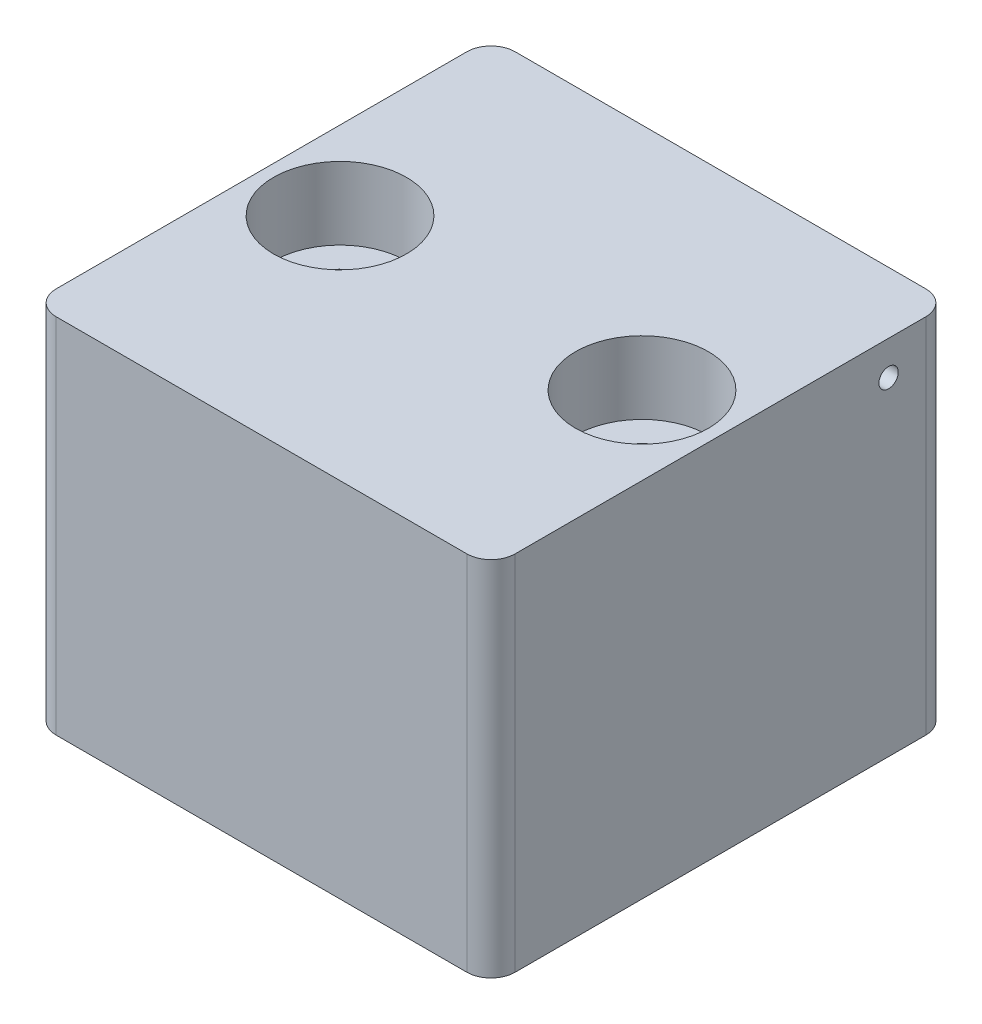
ISO-10303-21;
HEADER;
FILE_DESCRIPTION(('STEP AP214'),'2;1');
FILE_NAME('part.step','',(''),(''),'','','');
FILE_SCHEMA(('AUTOMOTIVE_DESIGN { 1 0 10303 214 1 1 1 1 }'));
ENDSEC;
DATA;
#1=APPLICATION_CONTEXT('core data for automotive mechanical design processes');
#2=APPLICATION_PROTOCOL_DEFINITION('international standard','automotive_design',2000,#1);
#3=PRODUCT_CONTEXT('',#1,'mechanical');
#4=PRODUCT('Part','Part','',(#3));
#5=PRODUCT_RELATED_PRODUCT_CATEGORY('part','',(#4));
#6=PRODUCT_DEFINITION_FORMATION('','',#4);
#7=PRODUCT_DEFINITION_CONTEXT('part definition',#1,'design');
#8=PRODUCT_DEFINITION('design','',#6,#7);
#9=PRODUCT_DEFINITION_SHAPE('','',#8);
#10=(LENGTH_UNIT() NAMED_UNIT(*) SI_UNIT(.MILLI.,.METRE.));
#11=(NAMED_UNIT(*) PLANE_ANGLE_UNIT() SI_UNIT($,.RADIAN.));
#12=(NAMED_UNIT(*) SI_UNIT($,.STERADIAN.) SOLID_ANGLE_UNIT());
#13=UNCERTAINTY_MEASURE_WITH_UNIT(LENGTH_MEASURE(1.E-05),#10,'distance_accuracy_value','');
#14=(GEOMETRIC_REPRESENTATION_CONTEXT(3) GLOBAL_UNCERTAINTY_ASSIGNED_CONTEXT((#13)) GLOBAL_UNIT_ASSIGNED_CONTEXT((#10,
#11,#12)) REPRESENTATION_CONTEXT('',''));
#15=CARTESIAN_POINT('',(0.,0.,0.));
#16=DIRECTION('',(0.,0.,1.));
#17=DIRECTION('',(1.,0.,0.));
#18=AXIS2_PLACEMENT_3D('',#15,#16,#17);
#19=CARTESIAN_POINT('',(15.75,-0.000999999999999265,-9.5));
#20=DIRECTION('',(0.,1.,0.));
#21=DIRECTION('',(0.,0.,1.));
#22=AXIS2_PLACEMENT_3D('',#19,#20,#21);
#23=CYLINDRICAL_SURFACE('',#22,1.525);
#24=CARTESIAN_POINT('',(15.75,0.,-9.5));
#25=DIRECTION('',(0.,-1.,0.));
#26=DIRECTION('',(0.,0.,-1.));
#27=AXIS2_PLACEMENT_3D('',#24,#25,#26);
#28=CIRCLE('',#27,1.525);
#29=CARTESIAN_POINT('',(15.75,0.,-7.975));
#30=VERTEX_POINT('',#29);
#31=EDGE_CURVE('E191',#30,#30,#28,.F.);
#32=CARTESIAN_POINT('',(15.75,12.,-9.5));
#33=DIRECTION('',(0.,1.,0.));
#34=DIRECTION('',(0.,0.,1.));
#35=AXIS2_PLACEMENT_3D('',#32,#33,#34);
#36=CIRCLE('',#35,1.525);
#37=CARTESIAN_POINT('',(15.75,12.,-7.975));
#38=VERTEX_POINT('',#37);
#39=EDGE_CURVE('E42',#38,#38,#36,.F.);
#40=CARTESIAN_POINT('',(15.75,0.,-7.975));
#41=CARTESIAN_POINT('',(15.75,0.125,-7.975));
#42=CARTESIAN_POINT('',(15.75,0.25,-7.975));
#43=CARTESIAN_POINT('',(15.75,0.5,-7.975));
#44=CARTESIAN_POINT('',(15.75,0.625,-7.975));
#45=CARTESIAN_POINT('',(15.75,0.875,-7.975));
#46=CARTESIAN_POINT('',(15.75,1.,-7.975));
#47=CARTESIAN_POINT('',(15.75,1.25,-7.975));
#48=CARTESIAN_POINT('',(15.75,1.375,-7.975));
#49=CARTESIAN_POINT('',(15.75,1.625,-7.975));
#50=CARTESIAN_POINT('',(15.75,1.75,-7.975));
#51=CARTESIAN_POINT('',(15.75,2.,-7.975));
#52=CARTESIAN_POINT('',(15.75,2.125,-7.975));
#53=CARTESIAN_POINT('',(15.75,2.375,-7.975));
#54=CARTESIAN_POINT('',(15.75,2.5,-7.975));
#55=CARTESIAN_POINT('',(15.75,2.75,-7.975));
#56=CARTESIAN_POINT('',(15.75,2.875,-7.975));
#57=CARTESIAN_POINT('',(15.75,3.125,-7.975));
#58=CARTESIAN_POINT('',(15.75,3.25,-7.975));
#59=CARTESIAN_POINT('',(15.75,3.5,-7.975));
#60=CARTESIAN_POINT('',(15.75,3.625,-7.975));
#61=CARTESIAN_POINT('',(15.75,3.875,-7.975));
#62=CARTESIAN_POINT('',(15.75,4.,-7.975));
#63=CARTESIAN_POINT('',(15.75,4.25,-7.975));
#64=CARTESIAN_POINT('',(15.75,4.375,-7.975));
#65=CARTESIAN_POINT('',(15.75,4.625,-7.975));
#66=CARTESIAN_POINT('',(15.75,4.75,-7.975));
#67=CARTESIAN_POINT('',(15.75,5.,-7.975));
#68=CARTESIAN_POINT('',(15.75,5.125,-7.975));
#69=CARTESIAN_POINT('',(15.75,5.375,-7.975));
#70=CARTESIAN_POINT('',(15.75,5.5,-7.975));
#71=CARTESIAN_POINT('',(15.75,5.75,-7.975));
#72=CARTESIAN_POINT('',(15.75,5.875,-7.975));
#73=CARTESIAN_POINT('',(15.75,6.125,-7.975));
#74=CARTESIAN_POINT('',(15.75,6.25,-7.975));
#75=CARTESIAN_POINT('',(15.75,6.5,-7.975));
#76=CARTESIAN_POINT('',(15.75,6.625,-7.975));
#77=CARTESIAN_POINT('',(15.75,6.875,-7.975));
#78=CARTESIAN_POINT('',(15.75,7.,-7.975));
#79=CARTESIAN_POINT('',(15.75,7.25,-7.975));
#80=CARTESIAN_POINT('',(15.75,7.375,-7.975));
#81=CARTESIAN_POINT('',(15.75,7.625,-7.975));
#82=CARTESIAN_POINT('',(15.75,7.75,-7.975));
#83=CARTESIAN_POINT('',(15.75,8.,-7.975));
#84=CARTESIAN_POINT('',(15.75,8.125,-7.975));
#85=CARTESIAN_POINT('',(15.75,8.375,-7.975));
#86=CARTESIAN_POINT('',(15.75,8.5,-7.975));
#87=CARTESIAN_POINT('',(15.75,8.75,-7.975));
#88=CARTESIAN_POINT('',(15.75,8.875,-7.975));
#89=CARTESIAN_POINT('',(15.75,9.125,-7.975));
#90=CARTESIAN_POINT('',(15.75,9.25,-7.975));
#91=CARTESIAN_POINT('',(15.75,9.5,-7.975));
#92=CARTESIAN_POINT('',(15.75,9.625,-7.975));
#93=CARTESIAN_POINT('',(15.75,9.875,-7.975));
#94=CARTESIAN_POINT('',(15.75,10.,-7.975));
#95=CARTESIAN_POINT('',(15.75,10.25,-7.975));
#96=CARTESIAN_POINT('',(15.75,10.375,-7.975));
#97=CARTESIAN_POINT('',(15.75,10.625,-7.975));
#98=CARTESIAN_POINT('',(15.75,10.75,-7.975));
#99=CARTESIAN_POINT('',(15.75,11.,-7.975));
#100=CARTESIAN_POINT('',(15.75,11.125,-7.975));
#101=CARTESIAN_POINT('',(15.75,11.375,-7.975));
#102=CARTESIAN_POINT('',(15.75,11.5,-7.975));
#103=CARTESIAN_POINT('',(15.75,11.75,-7.975));
#104=CARTESIAN_POINT('',(15.75,11.875,-7.975));
#105=CARTESIAN_POINT('',(15.75,12.,-7.975));
#106=B_SPLINE_CURVE_WITH_KNOTS('',3,(#40,#41,#42,#43,#44,#45,#46,#47,#48,#49,#50,#51,#52,#53,
#54,#55,#56,#57,#58,#59,#60,#61,#62,#63,#64,#65,#66,#67,#68,#69,#70,#71,#72,#73,#74,#75,#76,#77,
#78,#79,#80,#81,#82,#83,#84,#85,#86,#87,#88,#89,#90,#91,#92,#93,#94,#95,#96,#97,#98,#99,#100,
#101,#102,#103,#104,#105),.UNSPECIFIED.,.F.,.F.,(4,2,2,2,2,2,2,2,2,2,2,2,2,2,2,2,2,2,2,2,2,2,2,
2,2,2,2,2,2,2,2,2,4),(0.,0.375,0.75,1.125,1.5,1.875,2.25,2.625,3.,3.375,3.75,4.125,4.5,4.875,
5.25,5.625,6.,6.375,6.75,7.125,7.5,7.875,8.25,8.625,9.,9.375,9.75,10.125,10.5,10.875,11.25,
11.625,12.),.UNSPECIFIED.);
#107=EDGE_CURVE('BSEAM38',#30,#38,#106,.T.);
#108=ORIENTED_EDGE('',*,*,#31,.F.);
#109=ORIENTED_EDGE('',*,*,#39,.F.);
#110=ORIENTED_EDGE('',*,*,#107,.T.);
#111=ORIENTED_EDGE('',*,*,#107,.F.);
#112=EDGE_LOOP('',(#108,#110,#109,#111));
#113=FACE_BOUND('',#112,.T.);
#114=ADVANCED_FACE('F38',(#113),#23,.F.);
#115=CARTESIAN_POINT('',(3.25,-0.000999999999999265,-9.5));
#116=DIRECTION('',(0.,1.,0.));
#117=DIRECTION('',(0.,0.,1.));
#118=AXIS2_PLACEMENT_3D('',#115,#116,#117);
#119=CYLINDRICAL_SURFACE('',#118,1.525);
#120=CARTESIAN_POINT('',(3.25,0.,-9.5));
#121=DIRECTION('',(0.,-1.,0.));
#122=DIRECTION('',(0.,0.,-1.));
#123=AXIS2_PLACEMENT_3D('',#120,#121,#122);
#124=CIRCLE('',#123,1.525);
#125=CARTESIAN_POINT('',(3.25,0.,-7.975));
#126=VERTEX_POINT('',#125);
#127=EDGE_CURVE('E147',#126,#126,#124,.F.);
#128=CARTESIAN_POINT('',(3.25,12.,-9.5));
#129=DIRECTION('',(0.,1.,0.));
#130=DIRECTION('',(0.,0.,1.));
#131=AXIS2_PLACEMENT_3D('',#128,#129,#130);
#132=CIRCLE('',#131,1.525);
#133=CARTESIAN_POINT('',(3.25,12.,-7.975));
#134=VERTEX_POINT('',#133);
#135=EDGE_CURVE('E182',#134,#134,#132,.F.);
#136=CARTESIAN_POINT('',(3.25,0.,-7.975));
#137=CARTESIAN_POINT('',(3.25,0.125,-7.975));
#138=CARTESIAN_POINT('',(3.25,0.25,-7.975));
#139=CARTESIAN_POINT('',(3.25,0.5,-7.975));
#140=CARTESIAN_POINT('',(3.25,0.625,-7.975));
#141=CARTESIAN_POINT('',(3.25,0.875,-7.975));
#142=CARTESIAN_POINT('',(3.25,1.,-7.975));
#143=CARTESIAN_POINT('',(3.25,1.25,-7.975));
#144=CARTESIAN_POINT('',(3.25,1.375,-7.975));
#145=CARTESIAN_POINT('',(3.25,1.625,-7.975));
#146=CARTESIAN_POINT('',(3.25,1.75,-7.975));
#147=CARTESIAN_POINT('',(3.25,2.,-7.975));
#148=CARTESIAN_POINT('',(3.25,2.125,-7.975));
#149=CARTESIAN_POINT('',(3.25,2.375,-7.975));
#150=CARTESIAN_POINT('',(3.25,2.5,-7.975));
#151=CARTESIAN_POINT('',(3.25,2.75,-7.975));
#152=CARTESIAN_POINT('',(3.25,2.875,-7.975));
#153=CARTESIAN_POINT('',(3.25,3.125,-7.975));
#154=CARTESIAN_POINT('',(3.25,3.25,-7.975));
#155=CARTESIAN_POINT('',(3.25,3.5,-7.975));
#156=CARTESIAN_POINT('',(3.25,3.625,-7.975));
#157=CARTESIAN_POINT('',(3.25,3.875,-7.975));
#158=CARTESIAN_POINT('',(3.25,4.,-7.975));
#159=CARTESIAN_POINT('',(3.25,4.25,-7.975));
#160=CARTESIAN_POINT('',(3.25,4.375,-7.975));
#161=CARTESIAN_POINT('',(3.25,4.625,-7.975));
#162=CARTESIAN_POINT('',(3.25,4.75,-7.975));
#163=CARTESIAN_POINT('',(3.25,5.,-7.975));
#164=CARTESIAN_POINT('',(3.25,5.125,-7.975));
#165=CARTESIAN_POINT('',(3.25,5.375,-7.975));
#166=CARTESIAN_POINT('',(3.25,5.5,-7.975));
#167=CARTESIAN_POINT('',(3.25,5.75,-7.975));
#168=CARTESIAN_POINT('',(3.25,5.875,-7.975));
#169=CARTESIAN_POINT('',(3.25,6.125,-7.975));
#170=CARTESIAN_POINT('',(3.25,6.25,-7.975));
#171=CARTESIAN_POINT('',(3.25,6.5,-7.975));
#172=CARTESIAN_POINT('',(3.25,6.625,-7.975));
#173=CARTESIAN_POINT('',(3.25,6.875,-7.975));
#174=CARTESIAN_POINT('',(3.25,7.,-7.975));
#175=CARTESIAN_POINT('',(3.25,7.25,-7.975));
#176=CARTESIAN_POINT('',(3.25,7.375,-7.975));
#177=CARTESIAN_POINT('',(3.25,7.625,-7.975));
#178=CARTESIAN_POINT('',(3.25,7.75,-7.975));
#179=CARTESIAN_POINT('',(3.25,8.,-7.975));
#180=CARTESIAN_POINT('',(3.25,8.125,-7.975));
#181=CARTESIAN_POINT('',(3.25,8.375,-7.975));
#182=CARTESIAN_POINT('',(3.25,8.5,-7.975));
#183=CARTESIAN_POINT('',(3.25,8.75,-7.975));
#184=CARTESIAN_POINT('',(3.25,8.875,-7.975));
#185=CARTESIAN_POINT('',(3.25,9.125,-7.975));
#186=CARTESIAN_POINT('',(3.25,9.25,-7.975));
#187=CARTESIAN_POINT('',(3.25,9.5,-7.975));
#188=CARTESIAN_POINT('',(3.25,9.625,-7.975));
#189=CARTESIAN_POINT('',(3.25,9.875,-7.975));
#190=CARTESIAN_POINT('',(3.25,10.,-7.975));
#191=CARTESIAN_POINT('',(3.25,10.25,-7.975));
#192=CARTESIAN_POINT('',(3.25,10.375,-7.975));
#193=CARTESIAN_POINT('',(3.25,10.625,-7.975));
#194=CARTESIAN_POINT('',(3.25,10.75,-7.975));
#195=CARTESIAN_POINT('',(3.25,11.,-7.975));
#196=CARTESIAN_POINT('',(3.25,11.125,-7.975));
#197=CARTESIAN_POINT('',(3.25,11.375,-7.975));
#198=CARTESIAN_POINT('',(3.25,11.5,-7.975));
#199=CARTESIAN_POINT('',(3.25,11.75,-7.975));
#200=CARTESIAN_POINT('',(3.25,11.875,-7.975));
#201=CARTESIAN_POINT('',(3.25,12.,-7.975));
#202=B_SPLINE_CURVE_WITH_KNOTS('',3,(#136,#137,#138,#139,#140,#141,#142,#143,#144,#145,#146,
#147,#148,#149,#150,#151,#152,#153,#154,#155,#156,#157,#158,#159,#160,#161,#162,#163,#164,#165,
#166,#167,#168,#169,#170,#171,#172,#173,#174,#175,#176,#177,#178,#179,#180,#181,#182,#183,#184,
#185,#186,#187,#188,#189,#190,#191,#192,#193,#194,#195,#196,#197,#198,#199,#200,#201),
.UNSPECIFIED.,.F.,.F.,(4,2,2,2,2,2,2,2,2,2,2,2,2,2,2,2,2,2,2,2,2,2,2,2,2,2,2,2,2,2,2,2,4),(0.,
0.375,0.75,1.125,1.5,1.875,2.25,2.625,3.,3.375,3.75,4.125,4.5,4.875,5.25,5.625,6.,6.375,6.75,
7.125,7.5,7.875,8.25,8.625,9.,9.375,9.75,10.125,10.5,10.875,11.25,11.625,12.),.UNSPECIFIED.);
#203=EDGE_CURVE('BSEAM261',#126,#134,#202,.T.);
#204=ORIENTED_EDGE('',*,*,#127,.F.);
#205=ORIENTED_EDGE('',*,*,#135,.F.);
#206=ORIENTED_EDGE('',*,*,#203,.T.);
#207=ORIENTED_EDGE('',*,*,#203,.F.);
#208=EDGE_LOOP('',(#204,#206,#205,#207));
#209=FACE_BOUND('',#208,.T.);
#210=ADVANCED_FACE('F261',(#209),#119,.F.);
#211=CARTESIAN_POINT('',(18.,15.,-18.));
#212=DIRECTION('',(0.,-1.,0.));
#213=DIRECTION('',(0.,0.,-1.));
#214=AXIS2_PLACEMENT_3D('',#211,#212,#213);
#215=CYLINDRICAL_SURFACE('',#214,1.);
#216=CARTESIAN_POINT('',(18.,0.,-18.));
#217=DIRECTION('',(0.,1.,0.));
#218=DIRECTION('',(0.,0.,-1.));
#219=AXIS2_PLACEMENT_3D('',#216,#217,#218);
#220=CIRCLE('',#219,1.);
#221=CARTESIAN_POINT('',(19.,0.,-18.));
#222=VERTEX_POINT('',#221);
#223=CARTESIAN_POINT('',(18.,0.,-19.));
#224=VERTEX_POINT('',#223);
#225=EDGE_CURVE('E142',#222,#224,#220,.T.);
#226=ORIENTED_EDGE('',*,*,#225,.T.);
#227=DIRECTION('',(0.,-1.,0.));
#228=VECTOR('',#227,1.);
#229=CARTESIAN_POINT('',(18.,15.,-19.));
#230=LINE('',#229,#228);
#231=CARTESIAN_POINT('',(18.,15.,-19.));
#232=VERTEX_POINT('',#231);
#233=EDGE_CURVE('E11',#232,#224,#230,.T.);
#234=ORIENTED_EDGE('',*,*,#233,.F.);
#235=CARTESIAN_POINT('',(18.,15.,-18.));
#236=DIRECTION('',(0.,1.,0.));
#237=DIRECTION('',(0.,0.,-1.));
#238=AXIS2_PLACEMENT_3D('',#235,#236,#237);
#239=CIRCLE('',#238,1.);
#240=CARTESIAN_POINT('',(19.,15.,-18.));
#241=VERTEX_POINT('',#240);
#242=EDGE_CURVE('E165',#241,#232,#239,.T.);
#243=ORIENTED_EDGE('',*,*,#242,.F.);
#244=DIRECTION('',(0.,-1.,0.));
#245=VECTOR('',#244,1.);
#246=CARTESIAN_POINT('',(19.,15.,-18.));
#247=LINE('',#246,#245);
#248=EDGE_CURVE('E138',#241,#222,#247,.T.);
#249=ORIENTED_EDGE('',*,*,#248,.T.);
#250=EDGE_LOOP('',(#226,#234,#243,#249));
#251=FACE_BOUND('',#250,.T.);
#252=ADVANCED_FACE('F40',(#251),#215,.T.);
#253=CARTESIAN_POINT('',(1.00000000000001,15.,-19.));
#254=DIRECTION('',(0.,0.,1.));
#255=DIRECTION('',(1.,0.,0.));
#256=AXIS2_PLACEMENT_3D('',#253,#254,#255);
#257=PLANE('',#256);
#258=DIRECTION('',(-1.,0.,0.));
#259=VECTOR('',#258,1.);
#260=CARTESIAN_POINT('',(1.00000000000001,0.,-19.));
#261=LINE('',#260,#259);
#262=CARTESIAN_POINT('',(1.00000000000001,0.,-19.));
#263=VERTEX_POINT('',#262);
#264=EDGE_CURVE('E146',#224,#263,#261,.T.);
#265=ORIENTED_EDGE('',*,*,#264,.T.);
#266=DIRECTION('',(0.,-1.,0.));
#267=VECTOR('',#266,1.);
#268=CARTESIAN_POINT('',(1.00000000000001,15.,-19.));
#269=LINE('',#268,#267);
#270=CARTESIAN_POINT('',(1.00000000000001,15.,-19.));
#271=VERTEX_POINT('',#270);
#272=EDGE_CURVE('E49',#271,#263,#269,.T.);
#273=ORIENTED_EDGE('',*,*,#272,.F.);
#274=DIRECTION('',(-1.,0.,0.));
#275=VECTOR('',#274,1.);
#276=CARTESIAN_POINT('',(1.00000000000001,15.,-19.));
#277=LINE('',#276,#275);
#278=EDGE_CURVE('E101',#232,#271,#277,.T.);
#279=ORIENTED_EDGE('',*,*,#278,.F.);
#280=ORIENTED_EDGE('',*,*,#233,.T.);
#281=EDGE_LOOP('',(#265,#273,#279,#280));
#282=FACE_BOUND('',#281,.T.);
#283=ADVANCED_FACE('F323',(#282),#257,.F.);
#284=CARTESIAN_POINT('',(1.,15.,-18.));
#285=DIRECTION('',(0.,-1.,0.));
#286=DIRECTION('',(0.,0.,-1.));
#287=AXIS2_PLACEMENT_3D('',#284,#285,#286);
#288=CYLINDRICAL_SURFACE('',#287,1.);
#289=CARTESIAN_POINT('',(1.,0.,-18.));
#290=DIRECTION('',(0.,1.,0.));
#291=DIRECTION('',(0.,0.,-1.));
#292=AXIS2_PLACEMENT_3D('',#289,#290,#291);
#293=CIRCLE('',#292,1.);
#294=CARTESIAN_POINT('',(0.,0.,-18.));
#295=VERTEX_POINT('',#294);
#296=EDGE_CURVE('E150',#263,#295,#293,.T.);
#297=ORIENTED_EDGE('',*,*,#296,.T.);
#298=DIRECTION('',(0.,-1.,0.));
#299=VECTOR('',#298,1.);
#300=CARTESIAN_POINT('',(0.,15.,-18.));
#301=LINE('',#300,#299);
#302=CARTESIAN_POINT('',(0.,15.,-18.));
#303=VERTEX_POINT('',#302);
#304=EDGE_CURVE('E176',#303,#295,#301,.T.);
#305=ORIENTED_EDGE('',*,*,#304,.F.);
#306=CARTESIAN_POINT('',(1.,15.,-18.));
#307=DIRECTION('',(0.,1.,0.));
#308=DIRECTION('',(0.,0.,-1.));
#309=AXIS2_PLACEMENT_3D('',#306,#307,#308);
#310=CIRCLE('',#309,1.);
#311=EDGE_CURVE('E222',#271,#303,#310,.T.);
#312=ORIENTED_EDGE('',*,*,#311,.F.);
#313=ORIENTED_EDGE('',*,*,#272,.T.);
#314=EDGE_LOOP('',(#297,#305,#312,#313));
#315=FACE_BOUND('',#314,.T.);
#316=ADVANCED_FACE('F316',(#315),#288,.T.);
#317=CARTESIAN_POINT('',(0.,15.,-1.00000000000001));
#318=DIRECTION('',(1.,0.,0.));
#319=DIRECTION('',(0.,0.,-1.));
#320=AXIS2_PLACEMENT_3D('',#317,#318,#319);
#321=PLANE('',#320);
#322=CARTESIAN_POINT('',(0.,13.5876838207487,-16.458209363325));
#323=DIRECTION('',(-1.,0.,0.));
#324=DIRECTION('',(0.,0.,1.));
#325=AXIS2_PLACEMENT_3D('',#322,#323,#324);
#326=CIRCLE('',#325,0.400000000000002);
#327=CARTESIAN_POINT('',(0.,13.5876838207487,-16.058209363325));
#328=VERTEX_POINT('',#327);
#329=EDGE_CURVE('E311',#328,#328,#326,.T.);
#330=ORIENTED_EDGE('',*,*,#329,.F.);
#331=EDGE_LOOP('',(#330));
#332=FACE_BOUND('',#331,.T.);
#333=DIRECTION('',(0.,0.,1.));
#334=VECTOR('',#333,1.);
#335=CARTESIAN_POINT('',(0.,0.,-1.00000000000001));
#336=LINE('',#335,#334);
#337=CARTESIAN_POINT('',(0.,0.,-1.00000000000001));
#338=VERTEX_POINT('',#337);
#339=EDGE_CURVE('E153',#295,#338,#336,.T.);
#340=ORIENTED_EDGE('',*,*,#339,.T.);
#341=DIRECTION('',(0.,-1.,0.));
#342=VECTOR('',#341,1.);
#343=CARTESIAN_POINT('',(0.,15.,-1.00000000000001));
#344=LINE('',#343,#342);
#345=CARTESIAN_POINT('',(0.,15.,-1.00000000000001));
#346=VERTEX_POINT('',#345);
#347=EDGE_CURVE('E172',#346,#338,#344,.T.);
#348=ORIENTED_EDGE('',*,*,#347,.F.);
#349=DIRECTION('',(0.,0.,1.));
#350=VECTOR('',#349,1.);
#351=CARTESIAN_POINT('',(0.,15.,-1.00000000000001));
#352=LINE('',#351,#350);
#353=EDGE_CURVE('E225',#303,#346,#352,.T.);
#354=ORIENTED_EDGE('',*,*,#353,.F.);
#355=ORIENTED_EDGE('',*,*,#304,.T.);
#356=EDGE_LOOP('',(#340,#348,#354,#355));
#357=FACE_BOUND('',#356,.T.);
#358=ADVANCED_FACE('F233',(#332,#357),#321,.F.);
#359=CARTESIAN_POINT('',(1.,15.,-1.));
#360=DIRECTION('',(0.,-1.,0.));
#361=DIRECTION('',(0.,0.,-1.));
#362=AXIS2_PLACEMENT_3D('',#359,#360,#361);
#363=CYLINDRICAL_SURFACE('',#362,1.);
#364=CARTESIAN_POINT('',(1.,0.,-1.));
#365=DIRECTION('',(0.,1.,0.));
#366=DIRECTION('',(0.,0.,-1.));
#367=AXIS2_PLACEMENT_3D('',#364,#365,#366);
#368=CIRCLE('',#367,1.);
#369=CARTESIAN_POINT('',(1.00000000000001,0.,0.));
#370=VERTEX_POINT('',#369);
#371=EDGE_CURVE('E156',#338,#370,#368,.T.);
#372=ORIENTED_EDGE('',*,*,#371,.T.);
#373=DIRECTION('',(0.,-1.,0.));
#374=VECTOR('',#373,1.);
#375=CARTESIAN_POINT('',(1.00000000000001,15.,0.));
#376=LINE('',#375,#374);
#377=CARTESIAN_POINT('',(1.00000000000001,15.,0.));
#378=VERTEX_POINT('',#377);
#379=EDGE_CURVE('E131',#378,#370,#376,.T.);
#380=ORIENTED_EDGE('',*,*,#379,.F.);
#381=CARTESIAN_POINT('',(1.,15.,-1.));
#382=DIRECTION('',(0.,1.,0.));
#383=DIRECTION('',(0.,0.,-1.));
#384=AXIS2_PLACEMENT_3D('',#381,#382,#383);
#385=CIRCLE('',#384,1.);
#386=EDGE_CURVE('E120',#346,#378,#385,.T.);
#387=ORIENTED_EDGE('',*,*,#386,.F.);
#388=ORIENTED_EDGE('',*,*,#347,.T.);
#389=EDGE_LOOP('',(#372,#380,#387,#388));
#390=FACE_BOUND('',#389,.T.);
#391=ADVANCED_FACE('F237',(#390),#363,.T.);
#392=CARTESIAN_POINT('',(1.00000000000001,15.,0.));
#393=DIRECTION('',(0.,0.,-1.));
#394=DIRECTION('',(-1.,0.,0.));
#395=AXIS2_PLACEMENT_3D('',#392,#393,#394);
#396=PLANE('',#395);
#397=DIRECTION('',(1.,0.,0.));
#398=VECTOR('',#397,1.);
#399=CARTESIAN_POINT('',(1.00000000000001,0.,0.));
#400=LINE('',#399,#398);
#401=CARTESIAN_POINT('',(18.,0.,0.));
#402=VERTEX_POINT('',#401);
#403=EDGE_CURVE('E129',#370,#402,#400,.T.);
#404=ORIENTED_EDGE('',*,*,#403,.T.);
#405=DIRECTION('',(0.,-1.,0.));
#406=VECTOR('',#405,1.);
#407=CARTESIAN_POINT('',(18.,15.,0.));
#408=LINE('',#407,#406);
#409=CARTESIAN_POINT('',(18.,15.,0.));
#410=VERTEX_POINT('',#409);
#411=EDGE_CURVE('E126',#410,#402,#408,.T.);
#412=ORIENTED_EDGE('',*,*,#411,.F.);
#413=DIRECTION('',(1.,0.,0.));
#414=VECTOR('',#413,1.);
#415=CARTESIAN_POINT('',(1.00000000000001,15.,0.));
#416=LINE('',#415,#414);
#417=EDGE_CURVE('E114',#378,#410,#416,.T.);
#418=ORIENTED_EDGE('',*,*,#417,.F.);
#419=ORIENTED_EDGE('',*,*,#379,.T.);
#420=EDGE_LOOP('',(#404,#412,#418,#419));
#421=FACE_BOUND('',#420,.T.);
#422=ADVANCED_FACE('F127',(#421),#396,.F.);
#423=CARTESIAN_POINT('',(18.,15.,-1.));
#424=DIRECTION('',(0.,-1.,0.));
#425=DIRECTION('',(0.,0.,-1.));
#426=AXIS2_PLACEMENT_3D('',#423,#424,#425);
#427=CYLINDRICAL_SURFACE('',#426,1.);
#428=CARTESIAN_POINT('',(18.,0.,-1.));
#429=DIRECTION('',(0.,1.,0.));
#430=DIRECTION('',(0.,0.,1.));
#431=AXIS2_PLACEMENT_3D('',#428,#429,#430);
#432=CIRCLE('',#431,1.);
#433=CARTESIAN_POINT('',(19.,0.,-1.));
#434=VERTEX_POINT('',#433);
#435=EDGE_CURVE('E87',#402,#434,#432,.T.);
#436=ORIENTED_EDGE('',*,*,#435,.T.);
#437=DIRECTION('',(0.,-1.,0.));
#438=VECTOR('',#437,1.);
#439=CARTESIAN_POINT('',(19.,15.,-1.));
#440=LINE('',#439,#438);
#441=CARTESIAN_POINT('',(19.,15.,-1.));
#442=VERTEX_POINT('',#441);
#443=EDGE_CURVE('E132',#442,#434,#440,.T.);
#444=ORIENTED_EDGE('',*,*,#443,.F.);
#445=CARTESIAN_POINT('',(18.,15.,-1.));
#446=DIRECTION('',(0.,1.,0.));
#447=DIRECTION('',(0.,0.,1.));
#448=AXIS2_PLACEMENT_3D('',#445,#446,#447);
#449=CIRCLE('',#448,1.);
#450=EDGE_CURVE('E118',#410,#442,#449,.T.);
#451=ORIENTED_EDGE('',*,*,#450,.F.);
#452=ORIENTED_EDGE('',*,*,#411,.T.);
#453=EDGE_LOOP('',(#436,#444,#451,#452));
#454=FACE_BOUND('',#453,.T.);
#455=ADVANCED_FACE('F134',(#454),#427,.T.);
#456=CARTESIAN_POINT('',(19.,15.,-1.));
#457=DIRECTION('',(-1.,0.,0.));
#458=DIRECTION('',(0.,0.,1.));
#459=AXIS2_PLACEMENT_3D('',#456,#457,#458);
#460=PLANE('',#459);
#461=CARTESIAN_POINT('',(19.,13.5876838207487,-16.458209363325));
#462=DIRECTION('',(-1.,0.,0.));
#463=DIRECTION('',(0.,0.,1.));
#464=AXIS2_PLACEMENT_3D('',#461,#462,#463);
#465=CIRCLE('',#464,0.400000000000002);
#466=CARTESIAN_POINT('',(19.,13.5876838207487,-16.058209363325));
#467=VERTEX_POINT('',#466);
#468=EDGE_CURVE('E202',#467,#467,#465,.F.);
#469=ORIENTED_EDGE('',*,*,#468,.F.);
#470=EDGE_LOOP('',(#469));
#471=FACE_BOUND('',#470,.T.);
#472=DIRECTION('',(0.,0.,-1.));
#473=VECTOR('',#472,1.);
#474=CARTESIAN_POINT('',(19.,0.,-1.));
#475=LINE('',#474,#473);
#476=EDGE_CURVE('E93',#434,#222,#475,.T.);
#477=ORIENTED_EDGE('',*,*,#476,.T.);
#478=ORIENTED_EDGE('',*,*,#248,.F.);
#479=DIRECTION('',(0.,0.,-1.));
#480=VECTOR('',#479,1.);
#481=CARTESIAN_POINT('',(19.,15.,-1.));
#482=LINE('',#481,#480);
#483=EDGE_CURVE('E58',#442,#241,#482,.T.);
#484=ORIENTED_EDGE('',*,*,#483,.F.);
#485=ORIENTED_EDGE('',*,*,#443,.T.);
#486=EDGE_LOOP('',(#477,#478,#484,#485));
#487=FACE_BOUND('',#486,.T.);
#488=ADVANCED_FACE('F245',(#471,#487),#460,.F.);
#489=CARTESIAN_POINT('',(18.,15.,-18.));
#490=DIRECTION('',(0.,-1.,0.));
#491=DIRECTION('',(0.,0.,-1.));
#492=AXIS2_PLACEMENT_3D('',#489,#490,#491);
#493=PLANE('',#492);
#494=CARTESIAN_POINT('',(3.25,15.,-9.5));
#495=DIRECTION('',(0.,1.,0.));
#496=DIRECTION('',(0.,0.,1.));
#497=AXIS2_PLACEMENT_3D('',#494,#495,#496);
#498=CIRCLE('',#497,2.75);
#499=CARTESIAN_POINT('',(3.25,15.,-6.75));
#500=VERTEX_POINT('',#499);
#501=EDGE_CURVE('E193',#500,#500,#498,.T.);
#502=ORIENTED_EDGE('',*,*,#501,.F.);
#503=EDGE_LOOP('',(#502));
#504=FACE_BOUND('',#503,.T.);
#505=CARTESIAN_POINT('',(15.75,15.,-9.5));
#506=DIRECTION('',(0.,1.,0.));
#507=DIRECTION('',(0.,0.,1.));
#508=AXIS2_PLACEMENT_3D('',#505,#506,#507);
#509=CIRCLE('',#508,2.75);
#510=CARTESIAN_POINT('',(15.75,15.,-6.75));
#511=VERTEX_POINT('',#510);
#512=EDGE_CURVE('E208',#511,#511,#509,.T.);
#513=ORIENTED_EDGE('',*,*,#512,.F.);
#514=EDGE_LOOP('',(#513));
#515=FACE_BOUND('',#514,.T.);
#516=ORIENTED_EDGE('',*,*,#242,.T.);
#517=ORIENTED_EDGE('',*,*,#278,.T.);
#518=ORIENTED_EDGE('',*,*,#311,.T.);
#519=ORIENTED_EDGE('',*,*,#353,.T.);
#520=ORIENTED_EDGE('',*,*,#386,.T.);
#521=ORIENTED_EDGE('',*,*,#417,.T.);
#522=ORIENTED_EDGE('',*,*,#450,.T.);
#523=ORIENTED_EDGE('',*,*,#483,.T.);
#524=EDGE_LOOP('',(#516,#517,#518,#519,#520,#521,#522,#523));
#525=FACE_BOUND('',#524,.T.);
#526=ADVANCED_FACE('F116',(#504,#515,#525),#493,.F.);
#527=CARTESIAN_POINT('',(18.,0.,-18.));
#528=DIRECTION('',(0.,-1.,0.));
#529=DIRECTION('',(0.,0.,-1.));
#530=AXIS2_PLACEMENT_3D('',#527,#528,#529);
#531=PLANE('',#530);
#532=ORIENTED_EDGE('',*,*,#127,.T.);
#533=EDGE_LOOP('',(#532));
#534=FACE_BOUND('',#533,.T.);
#535=ORIENTED_EDGE('',*,*,#31,.T.);
#536=EDGE_LOOP('',(#535));
#537=FACE_BOUND('',#536,.T.);
#538=ORIENTED_EDGE('',*,*,#225,.F.);
#539=ORIENTED_EDGE('',*,*,#476,.F.);
#540=ORIENTED_EDGE('',*,*,#435,.F.);
#541=ORIENTED_EDGE('',*,*,#403,.F.);
#542=ORIENTED_EDGE('',*,*,#371,.F.);
#543=ORIENTED_EDGE('',*,*,#339,.F.);
#544=ORIENTED_EDGE('',*,*,#296,.F.);
#545=ORIENTED_EDGE('',*,*,#264,.F.);
#546=EDGE_LOOP('',(#538,#539,#540,#541,#542,#543,#544,#545));
#547=FACE_BOUND('',#546,.T.);
#548=ADVANCED_FACE('F240',(#534,#537,#547),#531,.T.);
#549=CARTESIAN_POINT('',(3.25,12.,-9.5));
#550=DIRECTION('',(0.,1.,0.));
#551=DIRECTION('',(0.,0.,1.));
#552=AXIS2_PLACEMENT_3D('',#549,#550,#551);
#553=PLANE('',#552);
#554=CARTESIAN_POINT('',(3.25,12.,-9.5));
#555=DIRECTION('',(0.,1.,0.));
#556=DIRECTION('',(0.,0.,1.));
#557=AXIS2_PLACEMENT_3D('',#554,#555,#556);
#558=CIRCLE('',#557,2.75);
#559=CARTESIAN_POINT('',(3.25,12.,-6.75));
#560=VERTEX_POINT('',#559);
#561=EDGE_CURVE('E185',#560,#560,#558,.T.);
#562=ORIENTED_EDGE('',*,*,#561,.T.);
#563=EDGE_LOOP('',(#562));
#564=FACE_BOUND('',#563,.T.);
#565=ORIENTED_EDGE('',*,*,#135,.T.);
#566=EDGE_LOOP('',(#565));
#567=FACE_BOUND('',#566,.T.);
#568=ADVANCED_FACE('F273',(#564,#567),#553,.T.);
#569=CARTESIAN_POINT('',(3.25,12.,-9.5));
#570=DIRECTION('',(0.,1.,0.));
#571=DIRECTION('',(0.,0.,1.));
#572=AXIS2_PLACEMENT_3D('',#569,#570,#571);
#573=CYLINDRICAL_SURFACE('',#572,2.75);
#574=ORIENTED_EDGE('',*,*,#561,.F.);
#575=EDGE_LOOP('',(#574));
#576=FACE_BOUND('',#575,.T.);
#577=ORIENTED_EDGE('',*,*,#501,.T.);
#578=EDGE_LOOP('',(#577));
#579=FACE_BOUND('',#578,.T.);
#580=ADVANCED_FACE('F278',(#576,#579),#573,.F.);
#581=CARTESIAN_POINT('',(15.75,12.,-9.5));
#582=DIRECTION('',(0.,1.,0.));
#583=DIRECTION('',(0.,0.,1.));
#584=AXIS2_PLACEMENT_3D('',#581,#582,#583);
#585=PLANE('',#584);
#586=CARTESIAN_POINT('',(15.75,12.,-9.5));
#587=DIRECTION('',(0.,1.,0.));
#588=DIRECTION('',(0.,0.,1.));
#589=AXIS2_PLACEMENT_3D('',#586,#587,#588);
#590=CIRCLE('',#589,2.75);
#591=CARTESIAN_POINT('',(15.75,12.,-6.75));
#592=VERTEX_POINT('',#591);
#593=EDGE_CURVE('E199',#592,#592,#590,.T.);
#594=ORIENTED_EDGE('',*,*,#593,.T.);
#595=EDGE_LOOP('',(#594));
#596=FACE_BOUND('',#595,.T.);
#597=ORIENTED_EDGE('',*,*,#39,.T.);
#598=EDGE_LOOP('',(#597));
#599=FACE_BOUND('',#598,.T.);
#600=ADVANCED_FACE('F286',(#596,#599),#585,.T.);
#601=CARTESIAN_POINT('',(15.75,12.,-9.5));
#602=DIRECTION('',(0.,1.,0.));
#603=DIRECTION('',(0.,0.,1.));
#604=AXIS2_PLACEMENT_3D('',#601,#602,#603);
#605=CYLINDRICAL_SURFACE('',#604,2.75);
#606=ORIENTED_EDGE('',*,*,#593,.F.);
#607=EDGE_LOOP('',(#606));
#608=FACE_BOUND('',#607,.T.);
#609=ORIENTED_EDGE('',*,*,#512,.T.);
#610=EDGE_LOOP('',(#609));
#611=FACE_BOUND('',#610,.T.);
#612=ADVANCED_FACE('F293',(#608,#611),#605,.F.);
#613=CARTESIAN_POINT('',(19.001,13.5876838207487,-16.458209363325));
#614=DIRECTION('',(-1.,0.,0.));
#615=DIRECTION('',(0.,0.,1.));
#616=AXIS2_PLACEMENT_3D('',#613,#614,#615);
#617=CYLINDRICAL_SURFACE('',#616,0.400000000000002);
#618=ORIENTED_EDGE('',*,*,#329,.T.);
#619=EDGE_LOOP('',(#618));
#620=FACE_BOUND('',#619,.T.);
#621=ORIENTED_EDGE('',*,*,#468,.T.);
#622=EDGE_LOOP('',(#621));
#623=FACE_BOUND('',#622,.T.);
#624=ADVANCED_FACE('F290',(#620,#623),#617,.F.);
#625=CLOSED_SHELL('',(#114,#210,#252,#283,#316,#358,#391,#422,#455,#488,#526,#548,#568,#580,
#600,#612,#624));
#626=MANIFOLD_SOLID_BREP('B2',#625);
#627=ADVANCED_BREP_SHAPE_REPRESENTATION('',(#18,#626),#14);
#628=SHAPE_DEFINITION_REPRESENTATION(#9,#627);
ENDSEC;
END-ISO-10303-21;
